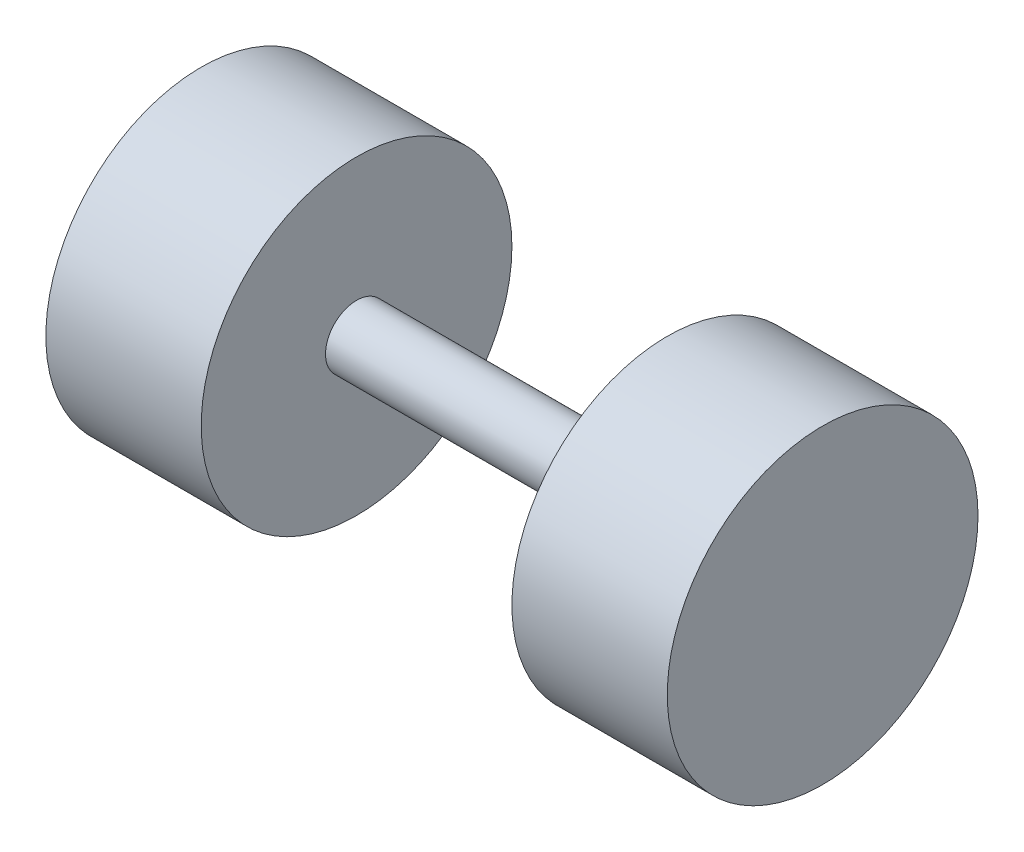
ISO-10303-21;
HEADER;
FILE_DESCRIPTION(('STEP AP214'),'2;1');
FILE_NAME('part.step','',(''),(''),'','','');
FILE_SCHEMA(('AUTOMOTIVE_DESIGN { 1 0 10303 214 1 1 1 1 }'));
ENDSEC;
DATA;
#1=APPLICATION_CONTEXT('core data for automotive mechanical design processes');
#2=APPLICATION_PROTOCOL_DEFINITION('international standard','automotive_design',2000,#1);
#3=PRODUCT_CONTEXT('',#1,'mechanical');
#4=PRODUCT('Part','Part','',(#3));
#5=PRODUCT_RELATED_PRODUCT_CATEGORY('part','',(#4));
#6=PRODUCT_DEFINITION_FORMATION('','',#4);
#7=PRODUCT_DEFINITION_CONTEXT('part definition',#1,'design');
#8=PRODUCT_DEFINITION('design','',#6,#7);
#9=PRODUCT_DEFINITION_SHAPE('','',#8);
#10=(LENGTH_UNIT() NAMED_UNIT(*) SI_UNIT(.MILLI.,.METRE.));
#11=(NAMED_UNIT(*) PLANE_ANGLE_UNIT() SI_UNIT($,.RADIAN.));
#12=(NAMED_UNIT(*) SI_UNIT($,.STERADIAN.) SOLID_ANGLE_UNIT());
#13=UNCERTAINTY_MEASURE_WITH_UNIT(LENGTH_MEASURE(1.E-05),#10,'distance_accuracy_value','');
#14=(GEOMETRIC_REPRESENTATION_CONTEXT(3) GLOBAL_UNCERTAINTY_ASSIGNED_CONTEXT((#13)) GLOBAL_UNIT_ASSIGNED_CONTEXT((#10,
#11,#12)) REPRESENTATION_CONTEXT('',''));
#15=CARTESIAN_POINT('',(0.,0.,0.));
#16=DIRECTION('',(0.,0.,1.));
#17=DIRECTION('',(1.,0.,0.));
#18=AXIS2_PLACEMENT_3D('',#15,#16,#17);
#19=CARTESIAN_POINT('',(0.,0.,0.));
#20=DIRECTION('',(1.,0.,0.));
#21=DIRECTION('',(0.,0.,-1.));
#22=AXIS2_PLACEMENT_3D('',#19,#20,#21);
#23=CYLINDRICAL_SURFACE('',#22,100.);
#24=CARTESIAN_POINT('',(0.,0.,0.));
#25=DIRECTION('',(1.,0.,0.));
#26=DIRECTION('',(0.,0.,-1.));
#27=AXIS2_PLACEMENT_3D('',#24,#25,#26);
#28=CIRCLE('',#27,100.);
#29=CARTESIAN_POINT('',(0.,0.,-100.));
#30=VERTEX_POINT('',#29);
#31=EDGE_CURVE('E10',#30,#30,#28,.T.);
#32=ORIENTED_EDGE('',*,*,#31,.F.);
#33=EDGE_LOOP('',(#32));
#34=FACE_BOUND('',#33,.T.);
#35=CARTESIAN_POINT('',(-1000.,0.,0.));
#36=DIRECTION('',(1.,0.,0.));
#37=DIRECTION('',(0.,0.,-1.));
#38=AXIS2_PLACEMENT_3D('',#35,#36,#37);
#39=CIRCLE('',#38,100.);
#40=CARTESIAN_POINT('',(-1000.,0.,-100.));
#41=VERTEX_POINT('',#40);
#42=EDGE_CURVE('E57',#41,#41,#39,.T.);
#43=ORIENTED_EDGE('',*,*,#42,.T.);
#44=EDGE_LOOP('',(#43));
#45=FACE_BOUND('',#44,.T.);
#46=ADVANCED_FACE('F43',(#34,#45),#23,.T.);
#47=CARTESIAN_POINT('',(0.,0.,0.));
#48=DIRECTION('',(1.,0.,0.));
#49=DIRECTION('',(0.,0.,-1.));
#50=AXIS2_PLACEMENT_3D('',#47,#48,#49);
#51=PLANE('',#50);
#52=CARTESIAN_POINT('',(0.,0.,0.));
#53=DIRECTION('',(1.,0.,0.));
#54=DIRECTION('',(0.,0.,-1.));
#55=AXIS2_PLACEMENT_3D('',#52,#53,#54);
#56=CIRCLE('',#55,500.);
#57=CARTESIAN_POINT('',(0.,0.,-500.));
#58=VERTEX_POINT('',#57);
#59=EDGE_CURVE('E49',#58,#58,#56,.T.);
#60=ORIENTED_EDGE('',*,*,#59,.F.);
#61=EDGE_LOOP('',(#60));
#62=FACE_BOUND('',#61,.T.);
#63=ORIENTED_EDGE('',*,*,#31,.T.);
#64=EDGE_LOOP('',(#63));
#65=FACE_BOUND('',#64,.T.);
#66=ADVANCED_FACE('F82',(#62,#65),#51,.F.);
#67=CARTESIAN_POINT('',(0.,0.,0.));
#68=DIRECTION('',(1.,0.,0.));
#69=DIRECTION('',(0.,0.,-1.));
#70=AXIS2_PLACEMENT_3D('',#67,#68,#69);
#71=CYLINDRICAL_SURFACE('',#70,500.);
#72=CARTESIAN_POINT('',(500.,0.,0.));
#73=DIRECTION('',(1.,0.,0.));
#74=DIRECTION('',(0.,0.,-1.));
#75=AXIS2_PLACEMENT_3D('',#72,#73,#74);
#76=CIRCLE('',#75,500.);
#77=CARTESIAN_POINT('',(500.,0.,-500.));
#78=VERTEX_POINT('',#77);
#79=EDGE_CURVE('E53',#78,#78,#76,.T.);
#80=ORIENTED_EDGE('',*,*,#79,.F.);
#81=EDGE_LOOP('',(#80));
#82=FACE_BOUND('',#81,.T.);
#83=ORIENTED_EDGE('',*,*,#59,.T.);
#84=EDGE_LOOP('',(#83));
#85=FACE_BOUND('',#84,.T.);
#86=ADVANCED_FACE('F87',(#82,#85),#71,.T.);
#87=CARTESIAN_POINT('',(500.,0.,0.));
#88=DIRECTION('',(1.,0.,0.));
#89=DIRECTION('',(0.,0.,-1.));
#90=AXIS2_PLACEMENT_3D('',#87,#88,#89);
#91=PLANE('',#90);
#92=ORIENTED_EDGE('',*,*,#79,.T.);
#93=EDGE_LOOP('',(#92));
#94=FACE_BOUND('',#93,.T.);
#95=ADVANCED_FACE('F93',(#94),#91,.T.);
#96=CARTESIAN_POINT('',(-1000.,0.,0.));
#97=DIRECTION('',(-1.,0.,0.));
#98=DIRECTION('',(0.,0.,-1.));
#99=AXIS2_PLACEMENT_3D('',#96,#97,#98);
#100=PLANE('',#99);
#101=CARTESIAN_POINT('',(-1000.,0.,0.));
#102=DIRECTION('',(1.,0.,0.));
#103=DIRECTION('',(0.,0.,-1.));
#104=AXIS2_PLACEMENT_3D('',#101,#102,#103);
#105=CIRCLE('',#104,500.);
#106=CARTESIAN_POINT('',(-1000.,0.,-500.));
#107=VERTEX_POINT('',#106);
#108=EDGE_CURVE('E63',#107,#107,#105,.T.);
#109=ORIENTED_EDGE('',*,*,#108,.T.);
#110=EDGE_LOOP('',(#109));
#111=FACE_BOUND('',#110,.T.);
#112=ORIENTED_EDGE('',*,*,#42,.F.);
#113=EDGE_LOOP('',(#112));
#114=FACE_BOUND('',#113,.T.);
#115=ADVANCED_FACE('F79',(#111,#114),#100,.F.);
#116=CARTESIAN_POINT('',(-1000.,0.,0.));
#117=DIRECTION('',(-1.,0.,0.));
#118=DIRECTION('',(0.,0.,-1.));
#119=AXIS2_PLACEMENT_3D('',#116,#117,#118);
#120=CYLINDRICAL_SURFACE('',#119,500.);
#121=CARTESIAN_POINT('',(-1500.,0.,0.));
#122=DIRECTION('',(1.,0.,0.));
#123=DIRECTION('',(0.,0.,-1.));
#124=AXIS2_PLACEMENT_3D('',#121,#122,#123);
#125=CIRCLE('',#124,500.);
#126=CARTESIAN_POINT('',(-1500.,0.,-500.));
#127=VERTEX_POINT('',#126);
#128=EDGE_CURVE('E66',#127,#127,#125,.T.);
#129=ORIENTED_EDGE('',*,*,#128,.T.);
#130=EDGE_LOOP('',(#129));
#131=FACE_BOUND('',#130,.T.);
#132=ORIENTED_EDGE('',*,*,#108,.F.);
#133=EDGE_LOOP('',(#132));
#134=FACE_BOUND('',#133,.T.);
#135=ADVANCED_FACE('F70',(#131,#134),#120,.T.);
#136=CARTESIAN_POINT('',(-1500.,0.,0.));
#137=DIRECTION('',(-1.,0.,0.));
#138=DIRECTION('',(0.,0.,-1.));
#139=AXIS2_PLACEMENT_3D('',#136,#137,#138);
#140=PLANE('',#139);
#141=ORIENTED_EDGE('',*,*,#128,.F.);
#142=EDGE_LOOP('',(#141));
#143=FACE_BOUND('',#142,.T.);
#144=ADVANCED_FACE('F73',(#143),#140,.T.);
#145=CLOSED_SHELL('',(#46,#66,#86,#95,#115,#135,#144));
#146=MANIFOLD_SOLID_BREP('B2',#145);
#147=ADVANCED_BREP_SHAPE_REPRESENTATION('',(#18,#146),#14);
#148=SHAPE_DEFINITION_REPRESENTATION(#9,#147);
ENDSEC;
END-ISO-10303-21;
